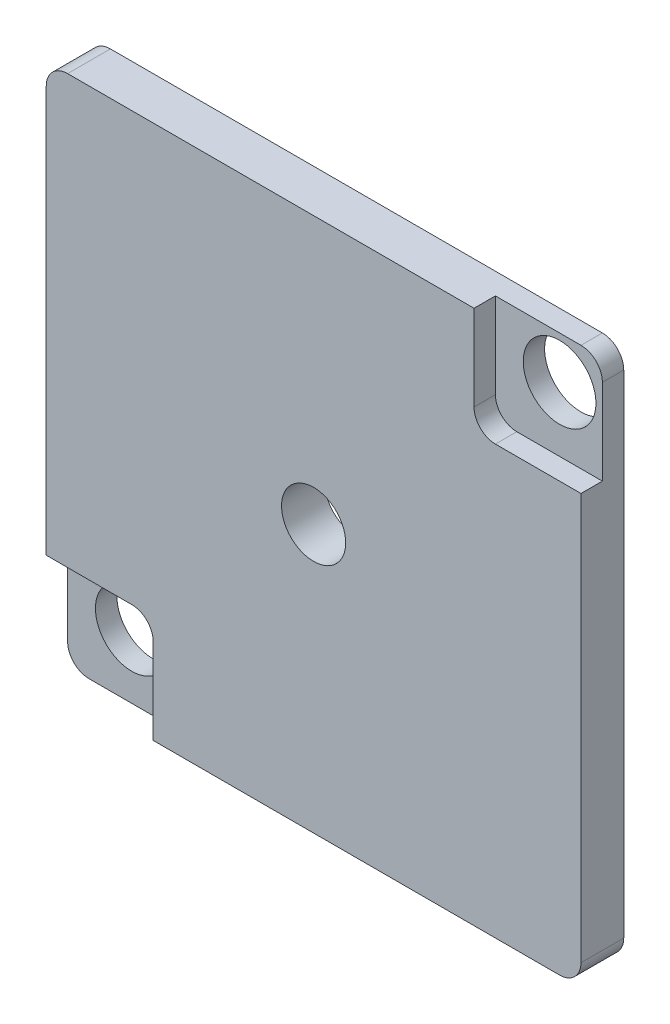
ISO-10303-21;
HEADER;
FILE_DESCRIPTION(('STEP AP214'),'2;1');
FILE_NAME('part.step','',(''),(''),'','','');
FILE_SCHEMA(('AUTOMOTIVE_DESIGN { 1 0 10303 214 1 1 1 1 }'));
ENDSEC;
DATA;
#1=APPLICATION_CONTEXT('core data for automotive mechanical design processes');
#2=APPLICATION_PROTOCOL_DEFINITION('international standard','automotive_design',2000,#1);
#3=PRODUCT_CONTEXT('',#1,'mechanical');
#4=PRODUCT('Part','Part','',(#3));
#5=PRODUCT_RELATED_PRODUCT_CATEGORY('part','',(#4));
#6=PRODUCT_DEFINITION_FORMATION('','',#4);
#7=PRODUCT_DEFINITION_CONTEXT('part definition',#1,'design');
#8=PRODUCT_DEFINITION('design','',#6,#7);
#9=PRODUCT_DEFINITION_SHAPE('','',#8);
#10=(LENGTH_UNIT() NAMED_UNIT(*) SI_UNIT(.MILLI.,.METRE.));
#11=(NAMED_UNIT(*) PLANE_ANGLE_UNIT() SI_UNIT($,.RADIAN.));
#12=(NAMED_UNIT(*) SI_UNIT($,.STERADIAN.) SOLID_ANGLE_UNIT());
#13=UNCERTAINTY_MEASURE_WITH_UNIT(LENGTH_MEASURE(1.E-05),#10,'distance_accuracy_value','');
#14=(GEOMETRIC_REPRESENTATION_CONTEXT(3) GLOBAL_UNCERTAINTY_ASSIGNED_CONTEXT((#13)) GLOBAL_UNIT_ASSIGNED_CONTEXT((#10,
#11,#12)) REPRESENTATION_CONTEXT('',''));
#15=CARTESIAN_POINT('',(0.,0.,0.));
#16=DIRECTION('',(0.,0.,1.));
#17=DIRECTION('',(1.,0.,0.));
#18=AXIS2_PLACEMENT_3D('',#15,#16,#17);
#19=CARTESIAN_POINT('',(0.,0.,1.));
#20=DIRECTION('',(0.,0.,1.));
#21=DIRECTION('',(1.,0.,0.));
#22=AXIS2_PLACEMENT_3D('',#19,#20,#21);
#23=PLANE('',#22);
#24=CARTESIAN_POINT('',(-9.5,-9.5,1.));
#25=DIRECTION('',(0.,0.,1.));
#26=DIRECTION('',(1.,0.,0.));
#27=AXIS2_PLACEMENT_3D('',#24,#25,#26);
#28=CIRCLE('',#27,1.69999999999999);
#29=CARTESIAN_POINT('',(-7.80000000000001,-9.5,1.));
#30=VERTEX_POINT('',#29);
#31=EDGE_CURVE('E369',#30,#30,#28,.T.);
#32=ORIENTED_EDGE('',*,*,#31,.F.);
#33=EDGE_LOOP('',(#32));
#34=FACE_BOUND('',#33,.T.);
#35=DIRECTION('',(0.,-1.,0.));
#36=VECTOR('',#35,1.);
#37=CARTESIAN_POINT('',(-12.5,0.,1.));
#38=LINE('',#37,#36);
#39=CARTESIAN_POINT('',(-12.5,-7.5,1.));
#40=VERTEX_POINT('',#39);
#41=CARTESIAN_POINT('',(-12.5,-11.5,1.));
#42=VERTEX_POINT('',#41);
#43=EDGE_CURVE('E210',#40,#42,#38,.T.);
#44=ORIENTED_EDGE('',*,*,#43,.T.);
#45=CARTESIAN_POINT('',(-11.5,-11.5,1.));
#46=DIRECTION('',(0.,0.,1.));
#47=DIRECTION('',(1.,0.,0.));
#48=AXIS2_PLACEMENT_3D('',#45,#46,#47);
#49=CIRCLE('',#48,1.);
#50=CARTESIAN_POINT('',(-11.5,-12.5,1.));
#51=VERTEX_POINT('',#50);
#52=EDGE_CURVE('E249',#42,#51,#49,.T.);
#53=ORIENTED_EDGE('',*,*,#52,.T.);
#54=DIRECTION('',(1.,0.,0.));
#55=VECTOR('',#54,1.);
#56=CARTESIAN_POINT('',(0.,-12.5,1.));
#57=LINE('',#56,#55);
#58=CARTESIAN_POINT('',(-7.5,-12.5,1.));
#59=VERTEX_POINT('',#58);
#60=EDGE_CURVE('E212',#51,#59,#57,.T.);
#61=ORIENTED_EDGE('',*,*,#60,.T.);
#62=DIRECTION('',(0.,-1.,0.));
#63=VECTOR('',#62,1.);
#64=CARTESIAN_POINT('',(-7.5,0.,1.));
#65=LINE('',#64,#63);
#66=CARTESIAN_POINT('',(-7.5,-8.5,1.));
#67=VERTEX_POINT('',#66);
#68=EDGE_CURVE('E198',#67,#59,#65,.T.);
#69=ORIENTED_EDGE('',*,*,#68,.F.);
#70=CARTESIAN_POINT('',(-8.5,-8.5,1.));
#71=DIRECTION('',(0.,0.,1.));
#72=DIRECTION('',(1.,0.,0.));
#73=AXIS2_PLACEMENT_3D('',#70,#71,#72);
#74=CIRCLE('',#73,1.);
#75=CARTESIAN_POINT('',(-8.5,-7.5,1.));
#76=VERTEX_POINT('',#75);
#77=EDGE_CURVE('E201',#67,#76,#74,.T.);
#78=ORIENTED_EDGE('',*,*,#77,.T.);
#79=DIRECTION('',(-1.,0.,0.));
#80=VECTOR('',#79,1.);
#81=CARTESIAN_POINT('',(0.,-7.5,1.));
#82=LINE('',#81,#80);
#83=EDGE_CURVE('E183',#76,#40,#82,.T.);
#84=ORIENTED_EDGE('',*,*,#83,.T.);
#85=EDGE_LOOP('',(#44,#53,#61,#69,#78,#84));
#86=FACE_BOUND('',#85,.T.);
#87=ADVANCED_FACE('F43',(#34,#86),#23,.T.);
#88=CARTESIAN_POINT('',(12.5,0.,1.));
#89=DIRECTION('',(1.,0.,0.));
#90=DIRECTION('',(0.,0.,-1.));
#91=AXIS2_PLACEMENT_3D('',#88,#89,#90);
#92=PLANE('',#91);
#93=DIRECTION('',(0.,-1.,0.));
#94=VECTOR('',#93,1.);
#95=CARTESIAN_POINT('',(12.5,0.,2.));
#96=LINE('',#95,#94);
#97=CARTESIAN_POINT('',(12.5,7.5,2.));
#98=VERTEX_POINT('',#97);
#99=CARTESIAN_POINT('',(12.5,-11.5,2.));
#100=VERTEX_POINT('',#99);
#101=EDGE_CURVE('E290',#98,#100,#96,.T.);
#102=ORIENTED_EDGE('',*,*,#101,.T.);
#103=DIRECTION('',(0.,0.,-1.));
#104=VECTOR('',#103,1.);
#105=CARTESIAN_POINT('',(12.5,-11.5,0.));
#106=LINE('',#105,#104);
#107=CARTESIAN_POINT('',(12.5,-11.5,0.));
#108=VERTEX_POINT('',#107);
#109=EDGE_CURVE('E225',#100,#108,#106,.T.);
#110=ORIENTED_EDGE('',*,*,#109,.T.);
#111=DIRECTION('',(0.,-1.,0.));
#112=VECTOR('',#111,1.);
#113=CARTESIAN_POINT('',(12.5,0.,0.));
#114=LINE('',#113,#112);
#115=CARTESIAN_POINT('',(12.5,11.5,0.));
#116=VERTEX_POINT('',#115);
#117=EDGE_CURVE('E204',#116,#108,#114,.T.);
#118=ORIENTED_EDGE('',*,*,#117,.F.);
#119=DIRECTION('',(0.,0.,-1.));
#120=VECTOR('',#119,1.);
#121=CARTESIAN_POINT('',(12.5,11.5,1.));
#122=LINE('',#121,#120);
#123=CARTESIAN_POINT('',(12.5,11.5,1.));
#124=VERTEX_POINT('',#123);
#125=EDGE_CURVE('E214',#116,#124,#122,.F.);
#126=ORIENTED_EDGE('',*,*,#125,.T.);
#127=DIRECTION('',(0.,-1.,0.));
#128=VECTOR('',#127,1.);
#129=CARTESIAN_POINT('',(12.5,0.,1.));
#130=LINE('',#129,#128);
#131=CARTESIAN_POINT('',(12.5,7.5,1.));
#132=VERTEX_POINT('',#131);
#133=EDGE_CURVE('E205',#124,#132,#130,.T.);
#134=ORIENTED_EDGE('',*,*,#133,.T.);
#135=DIRECTION('',(0.,0.,-1.));
#136=VECTOR('',#135,1.);
#137=CARTESIAN_POINT('',(12.5,7.5,2.));
#138=LINE('',#137,#136);
#139=EDGE_CURVE('E313',#98,#132,#138,.T.);
#140=ORIENTED_EDGE('',*,*,#139,.F.);
#141=EDGE_LOOP('',(#102,#110,#118,#126,#134,#140));
#142=FACE_BOUND('',#141,.T.);
#143=ADVANCED_FACE('F321',(#142),#92,.T.);
#144=CARTESIAN_POINT('',(0.,12.5,1.));
#145=DIRECTION('',(0.,1.,0.));
#146=DIRECTION('',(0.,0.,1.));
#147=AXIS2_PLACEMENT_3D('',#144,#145,#146);
#148=PLANE('',#147);
#149=DIRECTION('',(1.,0.,0.));
#150=VECTOR('',#149,1.);
#151=CARTESIAN_POINT('',(0.,12.5,0.));
#152=LINE('',#151,#150);
#153=CARTESIAN_POINT('',(-11.5,12.5,0.));
#154=VERTEX_POINT('',#153);
#155=CARTESIAN_POINT('',(11.5,12.5,0.));
#156=VERTEX_POINT('',#155);
#157=EDGE_CURVE('E217',#154,#156,#152,.T.);
#158=ORIENTED_EDGE('',*,*,#157,.F.);
#159=DIRECTION('',(0.,0.,-1.));
#160=VECTOR('',#159,1.);
#161=CARTESIAN_POINT('',(-11.5,12.5,2.));
#162=LINE('',#161,#160);
#163=CARTESIAN_POINT('',(-11.5,12.5,2.));
#164=VERTEX_POINT('',#163);
#165=EDGE_CURVE('E51',#154,#164,#162,.F.);
#166=ORIENTED_EDGE('',*,*,#165,.T.);
#167=DIRECTION('',(1.,0.,0.));
#168=VECTOR('',#167,1.);
#169=CARTESIAN_POINT('',(0.,12.5,2.));
#170=LINE('',#169,#168);
#171=CARTESIAN_POINT('',(7.5,12.5,2.));
#172=VERTEX_POINT('',#171);
#173=EDGE_CURVE('E259',#164,#172,#170,.T.);
#174=ORIENTED_EDGE('',*,*,#173,.T.);
#175=DIRECTION('',(0.,0.,-1.));
#176=VECTOR('',#175,1.);
#177=CARTESIAN_POINT('',(7.5,12.5,2.));
#178=LINE('',#177,#176);
#179=CARTESIAN_POINT('',(7.5,12.5,1.));
#180=VERTEX_POINT('',#179);
#181=EDGE_CURVE('E305',#172,#180,#178,.T.);
#182=ORIENTED_EDGE('',*,*,#181,.T.);
#183=DIRECTION('',(1.,0.,0.));
#184=VECTOR('',#183,1.);
#185=CARTESIAN_POINT('',(0.,12.5,1.));
#186=LINE('',#185,#184);
#187=CARTESIAN_POINT('',(11.5,12.5,1.));
#188=VERTEX_POINT('',#187);
#189=EDGE_CURVE('E207',#180,#188,#186,.T.);
#190=ORIENTED_EDGE('',*,*,#189,.T.);
#191=DIRECTION('',(0.,0.,-1.));
#192=VECTOR('',#191,1.);
#193=CARTESIAN_POINT('',(11.5,12.5,1.));
#194=LINE('',#193,#192);
#195=EDGE_CURVE('E251',#188,#156,#194,.T.);
#196=ORIENTED_EDGE('',*,*,#195,.T.);
#197=EDGE_LOOP('',(#158,#166,#174,#182,#190,#196));
#198=FACE_BOUND('',#197,.T.);
#199=ADVANCED_FACE('F257',(#198),#148,.T.);
#200=CARTESIAN_POINT('',(-12.5,0.,1.));
#201=DIRECTION('',(1.,0.,0.));
#202=DIRECTION('',(0.,0.,-1.));
#203=AXIS2_PLACEMENT_3D('',#200,#201,#202);
#204=PLANE('',#203);
#205=DIRECTION('',(0.,-1.,0.));
#206=VECTOR('',#205,1.);
#207=CARTESIAN_POINT('',(-12.5,0.,0.));
#208=LINE('',#207,#206);
#209=CARTESIAN_POINT('',(-12.5,11.5,0.));
#210=VERTEX_POINT('',#209);
#211=CARTESIAN_POINT('',(-12.5,-11.5,0.));
#212=VERTEX_POINT('',#211);
#213=EDGE_CURVE('E220',#210,#212,#208,.T.);
#214=ORIENTED_EDGE('',*,*,#213,.T.);
#215=DIRECTION('',(0.,0.,-1.));
#216=VECTOR('',#215,1.);
#217=CARTESIAN_POINT('',(-12.5,-11.5,1.));
#218=LINE('',#217,#216);
#219=EDGE_CURVE('E64',#212,#42,#218,.F.);
#220=ORIENTED_EDGE('',*,*,#219,.T.);
#221=ORIENTED_EDGE('',*,*,#43,.F.);
#222=DIRECTION('',(0.,0.,-1.));
#223=VECTOR('',#222,1.);
#224=CARTESIAN_POINT('',(-12.5,-7.5,2.));
#225=LINE('',#224,#223);
#226=CARTESIAN_POINT('',(-12.5,-7.5,2.));
#227=VERTEX_POINT('',#226);
#228=EDGE_CURVE('E303',#227,#40,#225,.T.);
#229=ORIENTED_EDGE('',*,*,#228,.F.);
#230=DIRECTION('',(0.,-1.,0.));
#231=VECTOR('',#230,1.);
#232=CARTESIAN_POINT('',(-12.5,0.,2.));
#233=LINE('',#232,#231);
#234=CARTESIAN_POINT('',(-12.5,11.5,2.));
#235=VERTEX_POINT('',#234);
#236=EDGE_CURVE('E174',#235,#227,#233,.T.);
#237=ORIENTED_EDGE('',*,*,#236,.F.);
#238=DIRECTION('',(0.,0.,-1.));
#239=VECTOR('',#238,1.);
#240=CARTESIAN_POINT('',(-12.5,11.5,0.));
#241=LINE('',#240,#239);
#242=EDGE_CURVE('E245',#235,#210,#241,.T.);
#243=ORIENTED_EDGE('',*,*,#242,.T.);
#244=EDGE_LOOP('',(#214,#220,#221,#229,#237,#243));
#245=FACE_BOUND('',#244,.T.);
#246=ADVANCED_FACE('F271',(#245),#204,.F.);
#247=CARTESIAN_POINT('',(0.,-12.5,1.));
#248=DIRECTION('',(0.,1.,0.));
#249=DIRECTION('',(0.,0.,1.));
#250=AXIS2_PLACEMENT_3D('',#247,#248,#249);
#251=PLANE('',#250);
#252=DIRECTION('',(1.,0.,0.));
#253=VECTOR('',#252,1.);
#254=CARTESIAN_POINT('',(0.,-12.5,0.));
#255=LINE('',#254,#253);
#256=CARTESIAN_POINT('',(-11.5,-12.5,0.));
#257=VERTEX_POINT('',#256);
#258=CARTESIAN_POINT('',(11.5,-12.5,0.));
#259=VERTEX_POINT('',#258);
#260=EDGE_CURVE('E208',#257,#259,#255,.T.);
#261=ORIENTED_EDGE('',*,*,#260,.T.);
#262=DIRECTION('',(0.,0.,-1.));
#263=VECTOR('',#262,1.);
#264=CARTESIAN_POINT('',(11.5,-12.5,2.));
#265=LINE('',#264,#263);
#266=CARTESIAN_POINT('',(11.5,-12.5,2.));
#267=VERTEX_POINT('',#266);
#268=EDGE_CURVE('E239',#259,#267,#265,.F.);
#269=ORIENTED_EDGE('',*,*,#268,.T.);
#270=DIRECTION('',(1.,0.,0.));
#271=VECTOR('',#270,1.);
#272=CARTESIAN_POINT('',(0.,-12.5,2.));
#273=LINE('',#272,#271);
#274=CARTESIAN_POINT('',(-7.5,-12.5,2.));
#275=VERTEX_POINT('',#274);
#276=EDGE_CURVE('E288',#275,#267,#273,.T.);
#277=ORIENTED_EDGE('',*,*,#276,.F.);
#278=DIRECTION('',(0.,0.,-1.));
#279=VECTOR('',#278,1.);
#280=CARTESIAN_POINT('',(-7.5,-12.5,2.));
#281=LINE('',#280,#279);
#282=EDGE_CURVE('E189',#275,#59,#281,.T.);
#283=ORIENTED_EDGE('',*,*,#282,.T.);
#284=ORIENTED_EDGE('',*,*,#60,.F.);
#285=DIRECTION('',(0.,0.,-1.));
#286=VECTOR('',#285,1.);
#287=CARTESIAN_POINT('',(-11.5,-12.5,1.));
#288=LINE('',#287,#286);
#289=EDGE_CURVE('E236',#51,#257,#288,.T.);
#290=ORIENTED_EDGE('',*,*,#289,.T.);
#291=EDGE_LOOP('',(#261,#269,#277,#283,#284,#290));
#292=FACE_BOUND('',#291,.T.);
#293=ADVANCED_FACE('F281',(#292),#251,.F.);
#294=CARTESIAN_POINT('',(10.5,10.5,1.));
#295=DIRECTION('',(0.,0.,1.));
#296=DIRECTION('',(1.,0.,0.));
#297=AXIS2_PLACEMENT_3D('',#294,#295,#296);
#298=CIRCLE('',#297,1.69999999999999);
#299=CARTESIAN_POINT('',(12.2,10.5,1.));
#300=VERTEX_POINT('',#299);
#301=EDGE_CURVE('E364',#300,#300,#298,.T.);
#302=ORIENTED_EDGE('',*,*,#301,.F.);
#303=EDGE_LOOP('',(#302));
#304=FACE_BOUND('',#303,.T.);
#305=ORIENTED_EDGE('',*,*,#133,.F.);
#306=CARTESIAN_POINT('',(11.5,11.5,1.));
#307=DIRECTION('',(0.,0.,1.));
#308=DIRECTION('',(1.,0.,0.));
#309=AXIS2_PLACEMENT_3D('',#306,#307,#308);
#310=CIRCLE('',#309,1.);
#311=EDGE_CURVE('E11',#124,#188,#310,.T.);
#312=ORIENTED_EDGE('',*,*,#311,.T.);
#313=ORIENTED_EDGE('',*,*,#189,.F.);
#314=DIRECTION('',(0.,1.,0.));
#315=VECTOR('',#314,1.);
#316=CARTESIAN_POINT('',(7.5,0.,1.));
#317=LINE('',#316,#315);
#318=CARTESIAN_POINT('',(7.5,8.5,1.));
#319=VERTEX_POINT('',#318);
#320=EDGE_CURVE('E184',#319,#180,#317,.T.);
#321=ORIENTED_EDGE('',*,*,#320,.F.);
#322=CARTESIAN_POINT('',(8.5,8.5,1.));
#323=DIRECTION('',(0.,0.,1.));
#324=DIRECTION('',(1.,0.,0.));
#325=AXIS2_PLACEMENT_3D('',#322,#323,#324);
#326=CIRCLE('',#325,1.);
#327=CARTESIAN_POINT('',(8.5,7.5,1.));
#328=VERTEX_POINT('',#327);
#329=EDGE_CURVE('E187',#328,#319,#326,.F.);
#330=ORIENTED_EDGE('',*,*,#329,.F.);
#331=DIRECTION('',(-1.,0.,0.));
#332=VECTOR('',#331,1.);
#333=CARTESIAN_POINT('',(0.,7.5,1.));
#334=LINE('',#333,#332);
#335=EDGE_CURVE('E195',#132,#328,#334,.T.);
#336=ORIENTED_EDGE('',*,*,#335,.F.);
#337=EDGE_LOOP('',(#305,#312,#313,#321,#330,#336));
#338=FACE_BOUND('',#337,.T.);
#339=ADVANCED_FACE('F330',(#304,#338),#23,.T.);
#340=CARTESIAN_POINT('',(0.,0.,0.));
#341=DIRECTION('',(0.,0.,1.));
#342=DIRECTION('',(1.,0.,0.));
#343=AXIS2_PLACEMENT_3D('',#340,#341,#342);
#344=PLANE('',#343);
#345=CARTESIAN_POINT('',(10.5,10.5,0.));
#346=DIRECTION('',(0.,0.,1.));
#347=DIRECTION('',(1.,0.,0.));
#348=AXIS2_PLACEMENT_3D('',#345,#346,#347);
#349=CIRCLE('',#348,1.69999999999999);
#350=CARTESIAN_POINT('',(12.2,10.5,0.));
#351=VERTEX_POINT('',#350);
#352=EDGE_CURVE('E366',#351,#351,#349,.T.);
#353=ORIENTED_EDGE('',*,*,#352,.T.);
#354=EDGE_LOOP('',(#353));
#355=FACE_BOUND('',#354,.T.);
#356=CARTESIAN_POINT('',(-9.5,-9.5,0.));
#357=DIRECTION('',(0.,0.,1.));
#358=DIRECTION('',(1.,0.,0.));
#359=AXIS2_PLACEMENT_3D('',#356,#357,#358);
#360=CIRCLE('',#359,1.69999999999999);
#361=CARTESIAN_POINT('',(-7.80000000000001,-9.5,0.));
#362=VERTEX_POINT('',#361);
#363=EDGE_CURVE('E374',#362,#362,#360,.T.);
#364=ORIENTED_EDGE('',*,*,#363,.T.);
#365=EDGE_LOOP('',(#364));
#366=FACE_BOUND('',#365,.T.);
#367=CARTESIAN_POINT('',(0.,0.,0.));
#368=DIRECTION('',(0.,0.,1.));
#369=DIRECTION('',(1.,0.,0.));
#370=AXIS2_PLACEMENT_3D('',#367,#368,#369);
#371=CIRCLE('',#370,1.5);
#372=CARTESIAN_POINT('',(1.5,0.,0.));
#373=VERTEX_POINT('',#372);
#374=EDGE_CURVE('E178',#373,#373,#371,.T.);
#375=ORIENTED_EDGE('',*,*,#374,.T.);
#376=EDGE_LOOP('',(#375));
#377=FACE_BOUND('',#376,.T.);
#378=ORIENTED_EDGE('',*,*,#117,.T.);
#379=CARTESIAN_POINT('',(11.5,-11.5,0.));
#380=DIRECTION('',(0.,0.,1.));
#381=DIRECTION('',(1.,0.,0.));
#382=AXIS2_PLACEMENT_3D('',#379,#380,#381);
#383=CIRCLE('',#382,1.);
#384=EDGE_CURVE('E234',#108,#259,#383,.F.);
#385=ORIENTED_EDGE('',*,*,#384,.T.);
#386=ORIENTED_EDGE('',*,*,#260,.F.);
#387=CARTESIAN_POINT('',(-11.5,-11.5,0.));
#388=DIRECTION('',(0.,0.,1.));
#389=DIRECTION('',(1.,0.,0.));
#390=AXIS2_PLACEMENT_3D('',#387,#388,#389);
#391=CIRCLE('',#390,1.);
#392=EDGE_CURVE('E232',#257,#212,#391,.F.);
#393=ORIENTED_EDGE('',*,*,#392,.T.);
#394=ORIENTED_EDGE('',*,*,#213,.F.);
#395=CARTESIAN_POINT('',(-11.5,11.5,0.));
#396=DIRECTION('',(0.,0.,1.));
#397=DIRECTION('',(1.,0.,0.));
#398=AXIS2_PLACEMENT_3D('',#395,#396,#397);
#399=CIRCLE('',#398,1.);
#400=EDGE_CURVE('E230',#210,#154,#399,.F.);
#401=ORIENTED_EDGE('',*,*,#400,.T.);
#402=ORIENTED_EDGE('',*,*,#157,.T.);
#403=CARTESIAN_POINT('',(11.5,11.5,0.));
#404=DIRECTION('',(0.,0.,1.));
#405=DIRECTION('',(1.,0.,0.));
#406=AXIS2_PLACEMENT_3D('',#403,#404,#405);
#407=CIRCLE('',#406,1.);
#408=EDGE_CURVE('E228',#156,#116,#407,.F.);
#409=ORIENTED_EDGE('',*,*,#408,.T.);
#410=EDGE_LOOP('',(#378,#385,#386,#393,#394,#401,#402,#409));
#411=FACE_BOUND('',#410,.T.);
#412=ADVANCED_FACE('F273',(#355,#366,#377,#411),#344,.F.);
#413=CARTESIAN_POINT('',(0.,-7.5,2.));
#414=DIRECTION('',(0.,1.,0.));
#415=DIRECTION('',(0.,0.,1.));
#416=AXIS2_PLACEMENT_3D('',#413,#414,#415);
#417=PLANE('',#416);
#418=ORIENTED_EDGE('',*,*,#83,.F.);
#419=DIRECTION('',(0.,0.,-1.));
#420=VECTOR('',#419,1.);
#421=CARTESIAN_POINT('',(-8.5,-7.5,2.));
#422=LINE('',#421,#420);
#423=CARTESIAN_POINT('',(-8.5,-7.5,2.));
#424=VERTEX_POINT('',#423);
#425=EDGE_CURVE('E161',#424,#76,#422,.T.);
#426=ORIENTED_EDGE('',*,*,#425,.F.);
#427=DIRECTION('',(1.,0.,0.));
#428=VECTOR('',#427,1.);
#429=CARTESIAN_POINT('',(0.,-7.5,2.));
#430=LINE('',#429,#428);
#431=EDGE_CURVE('E168',#227,#424,#430,.T.);
#432=ORIENTED_EDGE('',*,*,#431,.F.);
#433=ORIENTED_EDGE('',*,*,#228,.T.);
#434=EDGE_LOOP('',(#418,#426,#432,#433));
#435=FACE_BOUND('',#434,.T.);
#436=ADVANCED_FACE('F181',(#435),#417,.F.);
#437=CARTESIAN_POINT('',(-8.5,-8.5,2.));
#438=DIRECTION('',(0.,0.,-1.));
#439=DIRECTION('',(-1.,0.,0.));
#440=AXIS2_PLACEMENT_3D('',#437,#438,#439);
#441=CYLINDRICAL_SURFACE('',#440,1.);
#442=ORIENTED_EDGE('',*,*,#77,.F.);
#443=DIRECTION('',(0.,0.,-1.));
#444=VECTOR('',#443,1.);
#445=CARTESIAN_POINT('',(-7.5,-8.5,2.));
#446=LINE('',#445,#444);
#447=CARTESIAN_POINT('',(-7.5,-8.5,2.));
#448=VERTEX_POINT('',#447);
#449=EDGE_CURVE('E163',#448,#67,#446,.T.);
#450=ORIENTED_EDGE('',*,*,#449,.F.);
#451=CARTESIAN_POINT('',(-8.5,-8.5,2.));
#452=DIRECTION('',(0.,0.,1.));
#453=DIRECTION('',(1.,0.,0.));
#454=AXIS2_PLACEMENT_3D('',#451,#452,#453);
#455=CIRCLE('',#454,1.);
#456=EDGE_CURVE('E156',#424,#448,#455,.F.);
#457=ORIENTED_EDGE('',*,*,#456,.F.);
#458=ORIENTED_EDGE('',*,*,#425,.T.);
#459=EDGE_LOOP('',(#442,#450,#457,#458));
#460=FACE_BOUND('',#459,.T.);
#461=ADVANCED_FACE('F159',(#460),#441,.F.);
#462=CARTESIAN_POINT('',(-7.5,0.,2.));
#463=DIRECTION('',(-1.,0.,0.));
#464=DIRECTION('',(0.,-1.,0.));
#465=AXIS2_PLACEMENT_3D('',#462,#463,#464);
#466=PLANE('',#465);
#467=ORIENTED_EDGE('',*,*,#449,.T.);
#468=ORIENTED_EDGE('',*,*,#68,.T.);
#469=ORIENTED_EDGE('',*,*,#282,.F.);
#470=DIRECTION('',(0.,1.,0.));
#471=VECTOR('',#470,1.);
#472=CARTESIAN_POINT('',(-7.5,0.,2.));
#473=LINE('',#472,#471);
#474=EDGE_CURVE('E167',#275,#448,#473,.T.);
#475=ORIENTED_EDGE('',*,*,#474,.T.);
#476=EDGE_LOOP('',(#467,#468,#469,#475));
#477=FACE_BOUND('',#476,.T.);
#478=ADVANCED_FACE('F287',(#477),#466,.T.);
#479=CARTESIAN_POINT('',(0.,7.5,2.));
#480=DIRECTION('',(0.,1.,0.));
#481=DIRECTION('',(0.,0.,1.));
#482=AXIS2_PLACEMENT_3D('',#479,#480,#481);
#483=PLANE('',#482);
#484=ORIENTED_EDGE('',*,*,#139,.T.);
#485=ORIENTED_EDGE('',*,*,#335,.T.);
#486=DIRECTION('',(0.,0.,-1.));
#487=VECTOR('',#486,1.);
#488=CARTESIAN_POINT('',(8.5,7.5,2.));
#489=LINE('',#488,#487);
#490=CARTESIAN_POINT('',(8.5,7.5,2.));
#491=VERTEX_POINT('',#490);
#492=EDGE_CURVE('E310',#491,#328,#489,.T.);
#493=ORIENTED_EDGE('',*,*,#492,.F.);
#494=DIRECTION('',(1.,0.,0.));
#495=VECTOR('',#494,1.);
#496=CARTESIAN_POINT('',(0.,7.5,2.));
#497=LINE('',#496,#495);
#498=EDGE_CURVE('E295',#491,#98,#497,.T.);
#499=ORIENTED_EDGE('',*,*,#498,.T.);
#500=EDGE_LOOP('',(#484,#485,#493,#499));
#501=FACE_BOUND('',#500,.T.);
#502=ADVANCED_FACE('F316',(#501),#483,.T.);
#503=CARTESIAN_POINT('',(8.5,8.5,2.));
#504=DIRECTION('',(0.,0.,-1.));
#505=DIRECTION('',(-1.,0.,0.));
#506=AXIS2_PLACEMENT_3D('',#503,#504,#505);
#507=CYLINDRICAL_SURFACE('',#506,1.);
#508=ORIENTED_EDGE('',*,*,#492,.T.);
#509=ORIENTED_EDGE('',*,*,#329,.T.);
#510=DIRECTION('',(0.,0.,-1.));
#511=VECTOR('',#510,1.);
#512=CARTESIAN_POINT('',(7.5,8.5,2.));
#513=LINE('',#512,#511);
#514=CARTESIAN_POINT('',(7.5,8.5,2.));
#515=VERTEX_POINT('',#514);
#516=EDGE_CURVE('E307',#515,#319,#513,.T.);
#517=ORIENTED_EDGE('',*,*,#516,.F.);
#518=CARTESIAN_POINT('',(8.5,8.5,2.));
#519=DIRECTION('',(0.,0.,1.));
#520=DIRECTION('',(1.,0.,0.));
#521=AXIS2_PLACEMENT_3D('',#518,#519,#520);
#522=CIRCLE('',#521,1.);
#523=EDGE_CURVE('E298',#515,#491,#522,.T.);
#524=ORIENTED_EDGE('',*,*,#523,.T.);
#525=EDGE_LOOP('',(#508,#509,#517,#524));
#526=FACE_BOUND('',#525,.T.);
#527=ADVANCED_FACE('F334',(#526),#507,.F.);
#528=CARTESIAN_POINT('',(7.5,0.,2.));
#529=DIRECTION('',(1.,0.,0.));
#530=DIRECTION('',(0.,0.,-1.));
#531=AXIS2_PLACEMENT_3D('',#528,#529,#530);
#532=PLANE('',#531);
#533=ORIENTED_EDGE('',*,*,#516,.T.);
#534=ORIENTED_EDGE('',*,*,#320,.T.);
#535=ORIENTED_EDGE('',*,*,#181,.F.);
#536=DIRECTION('',(0.,-1.,0.));
#537=VECTOR('',#536,1.);
#538=CARTESIAN_POINT('',(7.5,0.,2.));
#539=LINE('',#538,#537);
#540=EDGE_CURVE('E266',#172,#515,#539,.T.);
#541=ORIENTED_EDGE('',*,*,#540,.T.);
#542=EDGE_LOOP('',(#533,#534,#535,#541));
#543=FACE_BOUND('',#542,.T.);
#544=ADVANCED_FACE('F332',(#543),#532,.T.);
#545=CARTESIAN_POINT('',(0.,0.,2.));
#546=DIRECTION('',(0.,0.,1.));
#547=DIRECTION('',(1.,0.,0.));
#548=AXIS2_PLACEMENT_3D('',#545,#546,#547);
#549=PLANE('',#548);
#550=CARTESIAN_POINT('',(0.,0.,2.));
#551=DIRECTION('',(0.,0.,1.));
#552=DIRECTION('',(1.,0.,0.));
#553=AXIS2_PLACEMENT_3D('',#550,#551,#552);
#554=CIRCLE('',#553,1.5);
#555=CARTESIAN_POINT('',(1.5,0.,2.));
#556=VERTEX_POINT('',#555);
#557=EDGE_CURVE('E377',#556,#556,#554,.T.);
#558=ORIENTED_EDGE('',*,*,#557,.F.);
#559=EDGE_LOOP('',(#558));
#560=FACE_BOUND('',#559,.T.);
#561=ORIENTED_EDGE('',*,*,#276,.T.);
#562=CARTESIAN_POINT('',(11.5,-11.5,2.));
#563=DIRECTION('',(0.,0.,1.));
#564=DIRECTION('',(1.,0.,0.));
#565=AXIS2_PLACEMENT_3D('',#562,#563,#564);
#566=CIRCLE('',#565,1.);
#567=EDGE_CURVE('E243',#267,#100,#566,.T.);
#568=ORIENTED_EDGE('',*,*,#567,.T.);
#569=ORIENTED_EDGE('',*,*,#101,.F.);
#570=ORIENTED_EDGE('',*,*,#498,.F.);
#571=ORIENTED_EDGE('',*,*,#523,.F.);
#572=ORIENTED_EDGE('',*,*,#540,.F.);
#573=ORIENTED_EDGE('',*,*,#173,.F.);
#574=CARTESIAN_POINT('',(-11.5,11.5,2.));
#575=DIRECTION('',(0.,0.,1.));
#576=DIRECTION('',(1.,0.,0.));
#577=AXIS2_PLACEMENT_3D('',#574,#575,#576);
#578=CIRCLE('',#577,1.);
#579=EDGE_CURVE('E241',#164,#235,#578,.T.);
#580=ORIENTED_EDGE('',*,*,#579,.T.);
#581=ORIENTED_EDGE('',*,*,#236,.T.);
#582=ORIENTED_EDGE('',*,*,#431,.T.);
#583=ORIENTED_EDGE('',*,*,#456,.T.);
#584=ORIENTED_EDGE('',*,*,#474,.F.);
#585=EDGE_LOOP('',(#561,#568,#569,#570,#571,#572,#573,#580,#581,#582,#583,#584));
#586=FACE_BOUND('',#585,.T.);
#587=ADVANCED_FACE('F172',(#560,#586),#549,.T.);
#588=CARTESIAN_POINT('',(11.5,-11.5,1.));
#589=DIRECTION('',(0.,0.,1.));
#590=DIRECTION('',(1.,0.,0.));
#591=AXIS2_PLACEMENT_3D('',#588,#589,#590);
#592=CYLINDRICAL_SURFACE('',#591,1.);
#593=ORIENTED_EDGE('',*,*,#567,.F.);
#594=ORIENTED_EDGE('',*,*,#268,.F.);
#595=ORIENTED_EDGE('',*,*,#384,.F.);
#596=ORIENTED_EDGE('',*,*,#109,.F.);
#597=EDGE_LOOP('',(#593,#594,#595,#596));
#598=FACE_BOUND('',#597,.T.);
#599=ADVANCED_FACE('F325',(#598),#592,.T.);
#600=CARTESIAN_POINT('',(-11.5,-11.5,1.));
#601=DIRECTION('',(0.,0.,-1.));
#602=DIRECTION('',(-1.,0.,0.));
#603=AXIS2_PLACEMENT_3D('',#600,#601,#602);
#604=CYLINDRICAL_SURFACE('',#603,1.);
#605=ORIENTED_EDGE('',*,*,#52,.F.);
#606=ORIENTED_EDGE('',*,*,#219,.F.);
#607=ORIENTED_EDGE('',*,*,#392,.F.);
#608=ORIENTED_EDGE('',*,*,#289,.F.);
#609=EDGE_LOOP('',(#605,#606,#607,#608));
#610=FACE_BOUND('',#609,.T.);
#611=ADVANCED_FACE('F278',(#610),#604,.T.);
#612=CARTESIAN_POINT('',(-11.5,11.5,1.));
#613=DIRECTION('',(0.,0.,1.));
#614=DIRECTION('',(1.,0.,0.));
#615=AXIS2_PLACEMENT_3D('',#612,#613,#614);
#616=CYLINDRICAL_SURFACE('',#615,1.);
#617=ORIENTED_EDGE('',*,*,#579,.F.);
#618=ORIENTED_EDGE('',*,*,#165,.F.);
#619=ORIENTED_EDGE('',*,*,#400,.F.);
#620=ORIENTED_EDGE('',*,*,#242,.F.);
#621=EDGE_LOOP('',(#617,#618,#619,#620));
#622=FACE_BOUND('',#621,.T.);
#623=ADVANCED_FACE('F269',(#622),#616,.T.);
#624=CARTESIAN_POINT('',(11.5,11.5,1.));
#625=DIRECTION('',(0.,0.,-1.));
#626=DIRECTION('',(-1.,0.,0.));
#627=AXIS2_PLACEMENT_3D('',#624,#625,#626);
#628=CYLINDRICAL_SURFACE('',#627,1.);
#629=ORIENTED_EDGE('',*,*,#311,.F.);
#630=ORIENTED_EDGE('',*,*,#125,.F.);
#631=ORIENTED_EDGE('',*,*,#408,.F.);
#632=ORIENTED_EDGE('',*,*,#195,.F.);
#633=EDGE_LOOP('',(#629,#630,#631,#632));
#634=FACE_BOUND('',#633,.T.);
#635=ADVANCED_FACE('F45',(#634),#628,.T.);
#636=CARTESIAN_POINT('',(0.,0.,0.));
#637=DIRECTION('',(0.,0.,1.));
#638=DIRECTION('',(1.,0.,0.));
#639=AXIS2_PLACEMENT_3D('',#636,#637,#638);
#640=CYLINDRICAL_SURFACE('',#639,1.5);
#641=ORIENTED_EDGE('',*,*,#374,.F.);
#642=EDGE_LOOP('',(#641));
#643=FACE_BOUND('',#642,.T.);
#644=ORIENTED_EDGE('',*,*,#557,.T.);
#645=EDGE_LOOP('',(#644));
#646=FACE_BOUND('',#645,.T.);
#647=ADVANCED_FACE('F383',(#643,#646),#640,.F.);
#648=CARTESIAN_POINT('',(-9.5,-9.5,1.));
#649=DIRECTION('',(0.,0.,1.));
#650=DIRECTION('',(1.,0.,0.));
#651=AXIS2_PLACEMENT_3D('',#648,#649,#650);
#652=CYLINDRICAL_SURFACE('',#651,1.69999999999999);
#653=ORIENTED_EDGE('',*,*,#363,.F.);
#654=EDGE_LOOP('',(#653));
#655=FACE_BOUND('',#654,.T.);
#656=ORIENTED_EDGE('',*,*,#31,.T.);
#657=EDGE_LOOP('',(#656));
#658=FACE_BOUND('',#657,.T.);
#659=ADVANCED_FACE('F394',(#655,#658),#652,.F.);
#660=CARTESIAN_POINT('',(10.5,10.5,1.));
#661=DIRECTION('',(0.,0.,1.));
#662=DIRECTION('',(1.,0.,0.));
#663=AXIS2_PLACEMENT_3D('',#660,#661,#662);
#664=CYLINDRICAL_SURFACE('',#663,1.69999999999999);
#665=ORIENTED_EDGE('',*,*,#352,.F.);
#666=EDGE_LOOP('',(#665));
#667=FACE_BOUND('',#666,.T.);
#668=ORIENTED_EDGE('',*,*,#301,.T.);
#669=EDGE_LOOP('',(#668));
#670=FACE_BOUND('',#669,.T.);
#671=ADVANCED_FACE('F398',(#667,#670),#664,.F.);
#672=CLOSED_SHELL('',(#87,#143,#199,#246,#293,#339,#412,#436,#461,#478,#502,#527,#544,#587,#599,
#611,#623,#635,#647,#659,#671));
#673=MANIFOLD_SOLID_BREP('B2',#672);
#674=ADVANCED_BREP_SHAPE_REPRESENTATION('',(#18,#673),#14);
#675=SHAPE_DEFINITION_REPRESENTATION(#9,#674);
ENDSEC;
END-ISO-10303-21;
